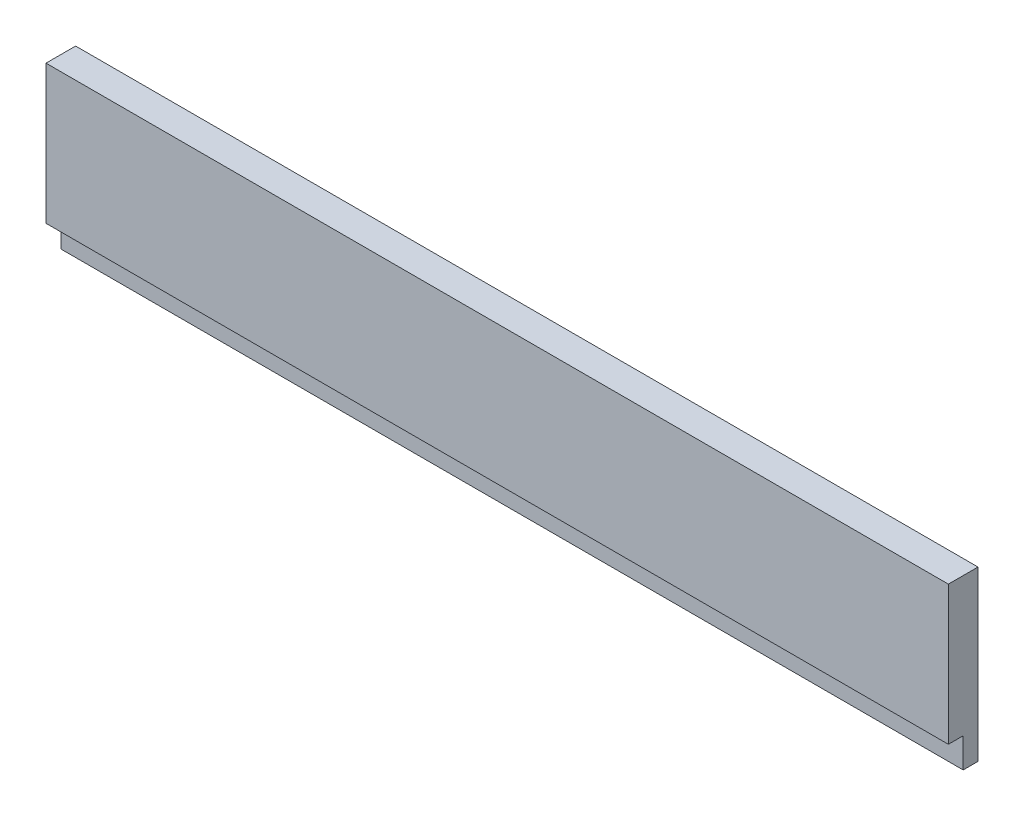
ISO-10303-21;
HEADER;
FILE_DESCRIPTION(('STEP AP214'),'2;1');
FILE_NAME('part.step','',(''),(''),'','','');
FILE_SCHEMA(('AUTOMOTIVE_DESIGN { 1 0 10303 214 1 1 1 1 }'));
ENDSEC;
DATA;
#1=APPLICATION_CONTEXT('core data for automotive mechanical design processes');
#2=APPLICATION_PROTOCOL_DEFINITION('international standard','automotive_design',2000,#1);
#3=PRODUCT_CONTEXT('',#1,'mechanical');
#4=PRODUCT('Part','Part','',(#3));
#5=PRODUCT_RELATED_PRODUCT_CATEGORY('part','',(#4));
#6=PRODUCT_DEFINITION_FORMATION('','',#4);
#7=PRODUCT_DEFINITION_CONTEXT('part definition',#1,'design');
#8=PRODUCT_DEFINITION('design','',#6,#7);
#9=PRODUCT_DEFINITION_SHAPE('','',#8);
#10=(LENGTH_UNIT() NAMED_UNIT(*) SI_UNIT(.MILLI.,.METRE.));
#11=(NAMED_UNIT(*) PLANE_ANGLE_UNIT() SI_UNIT($,.RADIAN.));
#12=(NAMED_UNIT(*) SI_UNIT($,.STERADIAN.) SOLID_ANGLE_UNIT());
#13=UNCERTAINTY_MEASURE_WITH_UNIT(LENGTH_MEASURE(1.E-05),#10,'distance_accuracy_value','');
#14=(GEOMETRIC_REPRESENTATION_CONTEXT(3) GLOBAL_UNCERTAINTY_ASSIGNED_CONTEXT((#13)) GLOBAL_UNIT_ASSIGNED_CONTEXT((#10,
#11,#12)) REPRESENTATION_CONTEXT('',''));
#15=CARTESIAN_POINT('',(0.,0.,0.));
#16=DIRECTION('',(0.,0.,1.));
#17=DIRECTION('',(1.,0.,0.));
#18=AXIS2_PLACEMENT_3D('',#15,#16,#17);
#19=CARTESIAN_POINT('',(535.670606995528,-40.1785714285714,22.));
#20=DIRECTION('',(0.,1.,0.));
#21=DIRECTION('',(-1.,0.,0.));
#22=AXIS2_PLACEMENT_3D('',#19,#20,#21);
#23=PLANE('',#22);
#24=DIRECTION('',(0.,0.,-1.));
#25=VECTOR('',#24,1.);
#26=CARTESIAN_POINT('',(535.670606995528,-40.1785714285714,22.));
#27=LINE('',#26,#25);
#28=CARTESIAN_POINT('',(535.670606995528,-40.1785714285714,11.));
#29=VERTEX_POINT('',#28);
#30=CARTESIAN_POINT('',(535.670606995528,-40.1785714285714,0.));
#31=VERTEX_POINT('',#30);
#32=EDGE_CURVE('E11',#29,#31,#27,.T.);
#33=ORIENTED_EDGE('',*,*,#32,.F.);
#34=DIRECTION('',(-1.,0.,0.));
#35=VECTOR('',#34,1.);
#36=CARTESIAN_POINT('',(535.670606995528,-40.1785714285714,11.));
#37=LINE('',#36,#35);
#38=CARTESIAN_POINT('',(-134.329393004472,-40.1785714285714,11.));
#39=VERTEX_POINT('',#38);
#40=EDGE_CURVE('E90',#29,#39,#37,.T.);
#41=ORIENTED_EDGE('',*,*,#40,.T.);
#42=DIRECTION('',(0.,0.,-1.));
#43=VECTOR('',#42,1.);
#44=CARTESIAN_POINT('',(-134.329393004472,-40.1785714285714,22.));
#45=LINE('',#44,#43);
#46=CARTESIAN_POINT('',(-134.329393004472,-40.1785714285714,0.));
#47=VERTEX_POINT('',#46);
#48=EDGE_CURVE('E83',#39,#47,#45,.T.);
#49=ORIENTED_EDGE('',*,*,#48,.T.);
#50=DIRECTION('',(1.,0.,0.));
#51=VECTOR('',#50,1.);
#52=CARTESIAN_POINT('',(535.670606995528,-40.1785714285714,0.));
#53=LINE('',#52,#51);
#54=EDGE_CURVE('E87',#47,#31,#53,.T.);
#55=ORIENTED_EDGE('',*,*,#54,.T.);
#56=EDGE_LOOP('',(#33,#41,#49,#55));
#57=FACE_BOUND('',#56,.T.);
#58=ADVANCED_FACE('F40',(#57),#23,.F.);
#59=CARTESIAN_POINT('',(535.670606995528,84.8214285714285,22.));
#60=DIRECTION('',(-1.,0.,0.));
#61=DIRECTION('',(0.,0.,1.));
#62=AXIS2_PLACEMENT_3D('',#59,#60,#61);
#63=PLANE('',#62);
#64=DIRECTION('',(0.,0.,-1.));
#65=VECTOR('',#64,1.);
#66=CARTESIAN_POINT('',(535.670606995528,-18.1785714285714,11.));
#67=LINE('',#66,#65);
#68=CARTESIAN_POINT('',(535.670606995528,-18.1785714285714,22.));
#69=VERTEX_POINT('',#68);
#70=CARTESIAN_POINT('',(535.670606995528,-18.1785714285714,11.));
#71=VERTEX_POINT('',#70);
#72=EDGE_CURVE('E55',#69,#71,#67,.T.);
#73=ORIENTED_EDGE('',*,*,#72,.T.);
#74=DIRECTION('',(0.,-1.,0.));
#75=VECTOR('',#74,1.);
#76=CARTESIAN_POINT('',(535.670606995528,-40.1785714285714,11.));
#77=LINE('',#76,#75);
#78=EDGE_CURVE('E136',#71,#29,#77,.T.);
#79=ORIENTED_EDGE('',*,*,#78,.T.);
#80=ORIENTED_EDGE('',*,*,#32,.T.);
#81=DIRECTION('',(0.,1.,0.));
#82=VECTOR('',#81,1.);
#83=CARTESIAN_POINT('',(535.670606995528,84.8214285714285,0.));
#84=LINE('',#83,#82);
#85=CARTESIAN_POINT('',(535.670606995528,84.8214285714285,0.));
#86=VERTEX_POINT('',#85);
#87=EDGE_CURVE('E110',#31,#86,#84,.T.);
#88=ORIENTED_EDGE('',*,*,#87,.T.);
#89=DIRECTION('',(0.,0.,-1.));
#90=VECTOR('',#89,1.);
#91=CARTESIAN_POINT('',(535.670606995528,84.8214285714285,22.));
#92=LINE('',#91,#90);
#93=CARTESIAN_POINT('',(535.670606995528,84.8214285714285,22.));
#94=VERTEX_POINT('',#93);
#95=EDGE_CURVE('E48',#94,#86,#92,.T.);
#96=ORIENTED_EDGE('',*,*,#95,.F.);
#97=DIRECTION('',(0.,1.,0.));
#98=VECTOR('',#97,1.);
#99=CARTESIAN_POINT('',(535.670606995528,84.8214285714285,22.));
#100=LINE('',#99,#98);
#101=EDGE_CURVE('E105',#69,#94,#100,.T.);
#102=ORIENTED_EDGE('',*,*,#101,.F.);
#103=EDGE_LOOP('',(#73,#79,#80,#88,#96,#102));
#104=FACE_BOUND('',#103,.T.);
#105=ADVANCED_FACE('F133',(#104),#63,.F.);
#106=CARTESIAN_POINT('',(-134.329393004472,84.8214285714285,22.));
#107=DIRECTION('',(0.,-1.,0.));
#108=DIRECTION('',(0.,0.,-1.));
#109=AXIS2_PLACEMENT_3D('',#106,#107,#108);
#110=PLANE('',#109);
#111=DIRECTION('',(-1.,0.,0.));
#112=VECTOR('',#111,1.);
#113=CARTESIAN_POINT('',(-134.329393004472,84.8214285714285,0.));
#114=LINE('',#113,#112);
#115=CARTESIAN_POINT('',(-134.329393004472,84.8214285714285,0.));
#116=VERTEX_POINT('',#115);
#117=EDGE_CURVE('E106',#86,#116,#114,.T.);
#118=ORIENTED_EDGE('',*,*,#117,.T.);
#119=DIRECTION('',(0.,0.,-1.));
#120=VECTOR('',#119,1.);
#121=CARTESIAN_POINT('',(-134.329393004472,84.8214285714285,22.));
#122=LINE('',#121,#120);
#123=CARTESIAN_POINT('',(-134.329393004472,84.8214285714285,22.));
#124=VERTEX_POINT('',#123);
#125=EDGE_CURVE('E94',#124,#116,#122,.T.);
#126=ORIENTED_EDGE('',*,*,#125,.F.);
#127=DIRECTION('',(-1.,0.,0.));
#128=VECTOR('',#127,1.);
#129=CARTESIAN_POINT('',(-134.329393004472,84.8214285714285,22.));
#130=LINE('',#129,#128);
#131=EDGE_CURVE('E64',#94,#124,#130,.T.);
#132=ORIENTED_EDGE('',*,*,#131,.F.);
#133=ORIENTED_EDGE('',*,*,#95,.T.);
#134=EDGE_LOOP('',(#118,#126,#132,#133));
#135=FACE_BOUND('',#134,.T.);
#136=ADVANCED_FACE('F130',(#135),#110,.F.);
#137=CARTESIAN_POINT('',(-134.329393004472,-40.1785714285714,22.));
#138=DIRECTION('',(1.,0.,0.));
#139=DIRECTION('',(0.,0.,-1.));
#140=AXIS2_PLACEMENT_3D('',#137,#138,#139);
#141=PLANE('',#140);
#142=ORIENTED_EDGE('',*,*,#48,.F.);
#143=DIRECTION('',(0.,-1.,0.));
#144=VECTOR('',#143,1.);
#145=CARTESIAN_POINT('',(-134.329393004472,-40.1785714285714,11.));
#146=LINE('',#145,#144);
#147=CARTESIAN_POINT('',(-134.329393004472,-18.1785714285714,11.));
#148=VERTEX_POINT('',#147);
#149=EDGE_CURVE('E147',#148,#39,#146,.T.);
#150=ORIENTED_EDGE('',*,*,#149,.F.);
#151=DIRECTION('',(0.,0.,-1.));
#152=VECTOR('',#151,1.);
#153=CARTESIAN_POINT('',(-134.329393004472,-18.1785714285714,11.));
#154=LINE('',#153,#152);
#155=CARTESIAN_POINT('',(-134.329393004472,-18.1785714285714,22.));
#156=VERTEX_POINT('',#155);
#157=EDGE_CURVE('E152',#156,#148,#154,.T.);
#158=ORIENTED_EDGE('',*,*,#157,.F.);
#159=DIRECTION('',(0.,-1.,0.));
#160=VECTOR('',#159,1.);
#161=CARTESIAN_POINT('',(-134.329393004472,-40.1785714285714,22.));
#162=LINE('',#161,#160);
#163=EDGE_CURVE('E95',#124,#156,#162,.T.);
#164=ORIENTED_EDGE('',*,*,#163,.F.);
#165=ORIENTED_EDGE('',*,*,#125,.T.);
#166=DIRECTION('',(0.,-1.,0.));
#167=VECTOR('',#166,1.);
#168=CARTESIAN_POINT('',(-134.329393004472,-40.1785714285714,0.));
#169=LINE('',#168,#167);
#170=EDGE_CURVE('E99',#116,#47,#169,.T.);
#171=ORIENTED_EDGE('',*,*,#170,.T.);
#172=EDGE_LOOP('',(#142,#150,#158,#164,#165,#171));
#173=FACE_BOUND('',#172,.T.);
#174=ADVANCED_FACE('F100',(#173),#141,.F.);
#175=CARTESIAN_POINT('',(0.,0.,22.));
#176=DIRECTION('',(0.,0.,-1.));
#177=DIRECTION('',(-1.,0.,0.));
#178=AXIS2_PLACEMENT_3D('',#175,#176,#177);
#179=PLANE('',#178);
#180=ORIENTED_EDGE('',*,*,#163,.T.);
#181=DIRECTION('',(-1.,0.,0.));
#182=VECTOR('',#181,1.);
#183=CARTESIAN_POINT('',(535.670606995528,-18.1785714285714,22.));
#184=LINE('',#183,#182);
#185=EDGE_CURVE('E163',#69,#156,#184,.T.);
#186=ORIENTED_EDGE('',*,*,#185,.F.);
#187=ORIENTED_EDGE('',*,*,#101,.T.);
#188=ORIENTED_EDGE('',*,*,#131,.T.);
#189=EDGE_LOOP('',(#180,#186,#187,#188));
#190=FACE_BOUND('',#189,.T.);
#191=ADVANCED_FACE('F171',(#190),#179,.F.);
#192=CARTESIAN_POINT('',(0.,0.,0.));
#193=DIRECTION('',(0.,0.,-1.));
#194=DIRECTION('',(-1.,0.,0.));
#195=AXIS2_PLACEMENT_3D('',#192,#193,#194);
#196=PLANE('',#195);
#197=ORIENTED_EDGE('',*,*,#54,.F.);
#198=ORIENTED_EDGE('',*,*,#170,.F.);
#199=ORIENTED_EDGE('',*,*,#117,.F.);
#200=ORIENTED_EDGE('',*,*,#87,.F.);
#201=EDGE_LOOP('',(#197,#198,#199,#200));
#202=FACE_BOUND('',#201,.T.);
#203=ADVANCED_FACE('F109',(#202),#196,.T.);
#204=CARTESIAN_POINT('',(535.670606995528,-40.1785714285714,11.));
#205=DIRECTION('',(0.,0.,-1.));
#206=DIRECTION('',(-1.,0.,0.));
#207=AXIS2_PLACEMENT_3D('',#204,#205,#206);
#208=PLANE('',#207);
#209=ORIENTED_EDGE('',*,*,#149,.T.);
#210=ORIENTED_EDGE('',*,*,#40,.F.);
#211=ORIENTED_EDGE('',*,*,#78,.F.);
#212=DIRECTION('',(-1.,0.,0.));
#213=VECTOR('',#212,1.);
#214=CARTESIAN_POINT('',(535.670606995528,-18.1785714285714,11.));
#215=LINE('',#214,#213);
#216=EDGE_CURVE('E117',#71,#148,#215,.T.);
#217=ORIENTED_EDGE('',*,*,#216,.T.);
#218=EDGE_LOOP('',(#209,#210,#211,#217));
#219=FACE_BOUND('',#218,.T.);
#220=ADVANCED_FACE('F148',(#219),#208,.F.);
#221=CARTESIAN_POINT('',(535.670606995528,-18.1785714285714,11.));
#222=DIRECTION('',(0.,1.,0.));
#223=DIRECTION('',(0.,0.,1.));
#224=AXIS2_PLACEMENT_3D('',#221,#222,#223);
#225=PLANE('',#224);
#226=ORIENTED_EDGE('',*,*,#157,.T.);
#227=ORIENTED_EDGE('',*,*,#216,.F.);
#228=ORIENTED_EDGE('',*,*,#72,.F.);
#229=ORIENTED_EDGE('',*,*,#185,.T.);
#230=EDGE_LOOP('',(#226,#227,#228,#229));
#231=FACE_BOUND('',#230,.T.);
#232=ADVANCED_FACE('F172',(#231),#225,.F.);
#233=CLOSED_SHELL('',(#58,#105,#136,#174,#191,#203,#220,#232));
#234=MANIFOLD_SOLID_BREP('B2',#233);
#235=ADVANCED_BREP_SHAPE_REPRESENTATION('',(#18,#234),#14);
#236=SHAPE_DEFINITION_REPRESENTATION(#9,#235);
ENDSEC;
END-ISO-10303-21;
